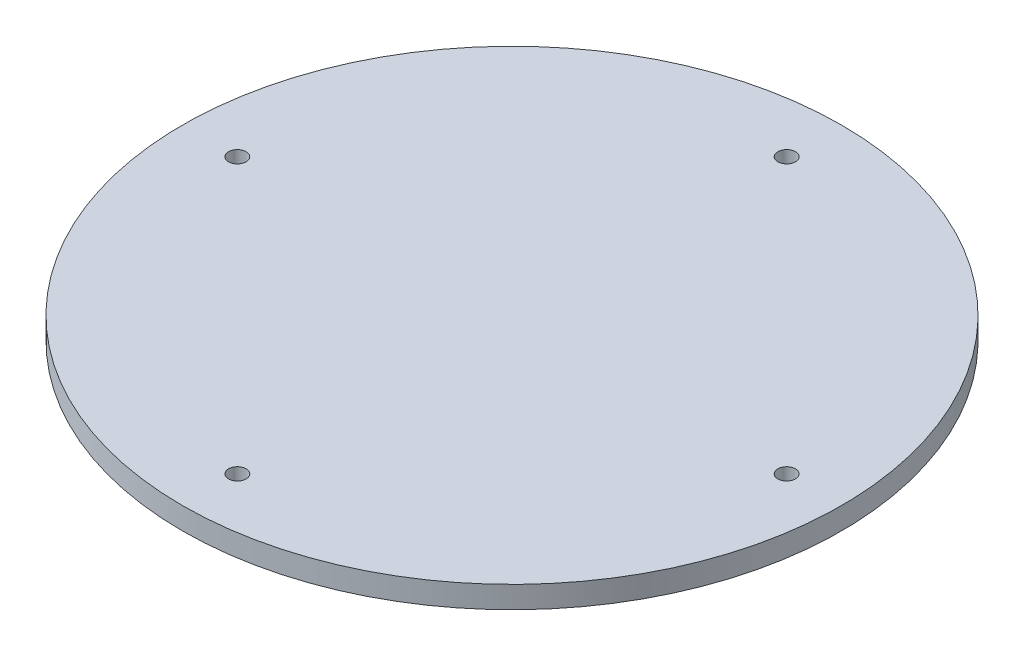
ISO-10303-21;
HEADER;
FILE_DESCRIPTION(('STEP AP214'),'2;1');
FILE_NAME('part.step','',(''),(''),'','','');
FILE_SCHEMA(('AUTOMOTIVE_DESIGN { 1 0 10303 214 1 1 1 1 }'));
ENDSEC;
DATA;
#1=APPLICATION_CONTEXT('core data for automotive mechanical design processes');
#2=APPLICATION_PROTOCOL_DEFINITION('international standard','automotive_design',2000,#1);
#3=PRODUCT_CONTEXT('',#1,'mechanical');
#4=PRODUCT('Part','Part','',(#3));
#5=PRODUCT_RELATED_PRODUCT_CATEGORY('part','',(#4));
#6=PRODUCT_DEFINITION_FORMATION('','',#4);
#7=PRODUCT_DEFINITION_CONTEXT('part definition',#1,'design');
#8=PRODUCT_DEFINITION('design','',#6,#7);
#9=PRODUCT_DEFINITION_SHAPE('','',#8);
#10=(LENGTH_UNIT() NAMED_UNIT(*) SI_UNIT(.MILLI.,.METRE.));
#11=(NAMED_UNIT(*) PLANE_ANGLE_UNIT() SI_UNIT($,.RADIAN.));
#12=(NAMED_UNIT(*) SI_UNIT($,.STERADIAN.) SOLID_ANGLE_UNIT());
#13=UNCERTAINTY_MEASURE_WITH_UNIT(LENGTH_MEASURE(1.E-05),#10,'distance_accuracy_value','');
#14=(GEOMETRIC_REPRESENTATION_CONTEXT(3) GLOBAL_UNCERTAINTY_ASSIGNED_CONTEXT((#13)) GLOBAL_UNIT_ASSIGNED_CONTEXT((#10,
#11,#12)) REPRESENTATION_CONTEXT('',''));
#15=CARTESIAN_POINT('',(0.,0.,0.));
#16=DIRECTION('',(0.,0.,1.));
#17=DIRECTION('',(1.,0.,0.));
#18=AXIS2_PLACEMENT_3D('',#15,#16,#17);
#19=CARTESIAN_POINT('',(0.,5.,0.));
#20=DIRECTION('',(0.,1.,0.));
#21=DIRECTION('',(0.,0.,1.));
#22=AXIS2_PLACEMENT_3D('',#19,#20,#21);
#23=PLANE('',#22);
#24=CARTESIAN_POINT('',(3.52975155131649E-12,5.,62.5));
#25=DIRECTION('',(0.,1.,0.));
#26=DIRECTION('',(0.,0.,1.));
#27=AXIS2_PLACEMENT_3D('',#24,#25,#26);
#28=CIRCLE('',#27,2.00000000000379);
#29=CARTESIAN_POINT('',(3.52975155131649E-12,5.,64.5000000000038));
#30=VERTEX_POINT('',#29);
#31=EDGE_CURVE('E57',#30,#30,#28,.T.);
#32=ORIENTED_EDGE('',*,*,#31,.F.);
#33=EDGE_LOOP('',(#32));
#34=FACE_BOUND('',#33,.T.);
#35=CARTESIAN_POINT('',(0.,5.,-62.5));
#36=DIRECTION('',(0.,1.,0.));
#37=DIRECTION('',(0.,0.,1.));
#38=AXIS2_PLACEMENT_3D('',#35,#36,#37);
#39=CIRCLE('',#38,2.);
#40=CARTESIAN_POINT('',(0.,5.,-60.5));
#41=VERTEX_POINT('',#40);
#42=EDGE_CURVE('E46',#41,#41,#39,.T.);
#43=ORIENTED_EDGE('',*,*,#42,.F.);
#44=EDGE_LOOP('',(#43));
#45=FACE_BOUND('',#44,.T.);
#46=CARTESIAN_POINT('',(0.,5.,0.));
#47=DIRECTION('',(0.,1.,0.));
#48=DIRECTION('',(0.,0.,1.));
#49=AXIS2_PLACEMENT_3D('',#46,#47,#48);
#50=CIRCLE('',#49,75.);
#51=CARTESIAN_POINT('',(0.,5.,75.));
#52=VERTEX_POINT('',#51);
#53=EDGE_CURVE('E10',#52,#52,#50,.T.);
#54=ORIENTED_EDGE('',*,*,#53,.T.);
#55=EDGE_LOOP('',(#54));
#56=FACE_BOUND('',#55,.T.);
#57=CARTESIAN_POINT('',(62.5000000000018,5.,-1.76487577565824E-12));
#58=DIRECTION('',(0.,1.,0.));
#59=DIRECTION('',(0.,0.,1.));
#60=AXIS2_PLACEMENT_3D('',#57,#58,#59);
#61=CIRCLE('',#60,2.00000000000138);
#62=CARTESIAN_POINT('',(62.5000000000018,5.,1.99999999999961));
#63=VERTEX_POINT('',#62);
#64=EDGE_CURVE('E51',#63,#63,#61,.T.);
#65=ORIENTED_EDGE('',*,*,#64,.F.);
#66=EDGE_LOOP('',(#65));
#67=FACE_BOUND('',#66,.T.);
#68=CARTESIAN_POINT('',(-62.4999999999982,5.,1.77252981815291E-12));
#69=DIRECTION('',(0.,1.,0.));
#70=DIRECTION('',(0.,0.,1.));
#71=AXIS2_PLACEMENT_3D('',#68,#69,#70);
#72=CIRCLE('',#71,2.00000000000284);
#73=CARTESIAN_POINT('',(-62.4999999999982,5.,2.00000000000461));
#74=VERTEX_POINT('',#73);
#75=EDGE_CURVE('E63',#74,#74,#72,.T.);
#76=ORIENTED_EDGE('',*,*,#75,.F.);
#77=EDGE_LOOP('',(#76));
#78=FACE_BOUND('',#77,.T.);
#79=ADVANCED_FACE('F35',(#34,#45,#56,#67,#78),#23,.T.);
#80=CARTESIAN_POINT('',(0.,0.,0.));
#81=DIRECTION('',(0.,1.,0.));
#82=DIRECTION('',(0.,0.,1.));
#83=AXIS2_PLACEMENT_3D('',#80,#81,#82);
#84=PLANE('',#83);
#85=CARTESIAN_POINT('',(0.,0.,0.));
#86=DIRECTION('',(0.,1.,0.));
#87=DIRECTION('',(0.,0.,1.));
#88=AXIS2_PLACEMENT_3D('',#85,#86,#87);
#89=CIRCLE('',#88,75.);
#90=CARTESIAN_POINT('',(0.,0.,75.));
#91=VERTEX_POINT('',#90);
#92=EDGE_CURVE('E39',#91,#91,#89,.T.);
#93=ORIENTED_EDGE('',*,*,#92,.F.);
#94=EDGE_LOOP('',(#93));
#95=FACE_BOUND('',#94,.T.);
#96=CARTESIAN_POINT('',(0.,0.,-62.5));
#97=DIRECTION('',(0.,1.,0.));
#98=DIRECTION('',(0.,0.,1.));
#99=AXIS2_PLACEMENT_3D('',#96,#97,#98);
#100=CIRCLE('',#99,2.);
#101=CARTESIAN_POINT('',(0.,0.,-60.5));
#102=VERTEX_POINT('',#101);
#103=EDGE_CURVE('E48',#102,#102,#100,.T.);
#104=ORIENTED_EDGE('',*,*,#103,.T.);
#105=EDGE_LOOP('',(#104));
#106=FACE_BOUND('',#105,.T.);
#107=CARTESIAN_POINT('',(62.5000000000018,0.,-1.76487577565824E-12));
#108=DIRECTION('',(0.,1.,0.));
#109=DIRECTION('',(0.,0.,1.));
#110=AXIS2_PLACEMENT_3D('',#107,#108,#109);
#111=CIRCLE('',#110,2.00000000000138);
#112=CARTESIAN_POINT('',(62.5000000000018,0.,1.99999999999961));
#113=VERTEX_POINT('',#112);
#114=EDGE_CURVE('E54',#113,#113,#111,.T.);
#115=ORIENTED_EDGE('',*,*,#114,.T.);
#116=EDGE_LOOP('',(#115));
#117=FACE_BOUND('',#116,.T.);
#118=CARTESIAN_POINT('',(3.52975155131649E-12,0.,62.5));
#119=DIRECTION('',(0.,1.,0.));
#120=DIRECTION('',(0.,0.,1.));
#121=AXIS2_PLACEMENT_3D('',#118,#119,#120);
#122=CIRCLE('',#121,2.00000000000379);
#123=CARTESIAN_POINT('',(3.52975155131649E-12,0.,64.5000000000038));
#124=VERTEX_POINT('',#123);
#125=EDGE_CURVE('E60',#124,#124,#122,.T.);
#126=ORIENTED_EDGE('',*,*,#125,.T.);
#127=EDGE_LOOP('',(#126));
#128=FACE_BOUND('',#127,.T.);
#129=CARTESIAN_POINT('',(-62.4999999999982,0.,1.77252981815291E-12));
#130=DIRECTION('',(0.,1.,0.));
#131=DIRECTION('',(0.,0.,1.));
#132=AXIS2_PLACEMENT_3D('',#129,#130,#131);
#133=CIRCLE('',#132,2.00000000000284);
#134=CARTESIAN_POINT('',(-62.4999999999982,0.,2.00000000000461));
#135=VERTEX_POINT('',#134);
#136=EDGE_CURVE('E66',#135,#135,#133,.T.);
#137=ORIENTED_EDGE('',*,*,#136,.T.);
#138=EDGE_LOOP('',(#137));
#139=FACE_BOUND('',#138,.T.);
#140=ADVANCED_FACE('F76',(#95,#106,#117,#128,#139),#84,.F.);
#141=CARTESIAN_POINT('',(0.,5.,0.));
#142=DIRECTION('',(0.,-1.,0.));
#143=DIRECTION('',(0.,0.,-1.));
#144=AXIS2_PLACEMENT_3D('',#141,#142,#143);
#145=CYLINDRICAL_SURFACE('',#144,75.);
#146=ORIENTED_EDGE('',*,*,#53,.F.);
#147=EDGE_LOOP('',(#146));
#148=FACE_BOUND('',#147,.T.);
#149=ORIENTED_EDGE('',*,*,#92,.T.);
#150=EDGE_LOOP('',(#149));
#151=FACE_BOUND('',#150,.T.);
#152=ADVANCED_FACE('F37',(#148,#151),#145,.T.);
#153=CARTESIAN_POINT('',(0.,5.,-62.5));
#154=DIRECTION('',(0.,-1.,0.));
#155=DIRECTION('',(0.,0.,-1.));
#156=AXIS2_PLACEMENT_3D('',#153,#154,#155);
#157=CYLINDRICAL_SURFACE('',#156,2.);
#158=ORIENTED_EDGE('',*,*,#42,.T.);
#159=EDGE_LOOP('',(#158));
#160=FACE_BOUND('',#159,.T.);
#161=ORIENTED_EDGE('',*,*,#103,.F.);
#162=EDGE_LOOP('',(#161));
#163=FACE_BOUND('',#162,.T.);
#164=ADVANCED_FACE('F86',(#160,#163),#157,.F.);
#165=CARTESIAN_POINT('',(62.5000000000018,5.,-1.76487577565824E-12));
#166=DIRECTION('',(0.,-1.,0.));
#167=DIRECTION('',(0.,0.,-1.));
#168=AXIS2_PLACEMENT_3D('',#165,#166,#167);
#169=CYLINDRICAL_SURFACE('',#168,2.00000000000138);
#170=ORIENTED_EDGE('',*,*,#64,.T.);
#171=EDGE_LOOP('',(#170));
#172=FACE_BOUND('',#171,.T.);
#173=ORIENTED_EDGE('',*,*,#114,.F.);
#174=EDGE_LOOP('',(#173));
#175=FACE_BOUND('',#174,.T.);
#176=ADVANCED_FACE('F89',(#172,#175),#169,.F.);
#177=CARTESIAN_POINT('',(3.52975155131649E-12,5.,62.5));
#178=DIRECTION('',(0.,-1.,0.));
#179=DIRECTION('',(0.,0.,-1.));
#180=AXIS2_PLACEMENT_3D('',#177,#178,#179);
#181=CYLINDRICAL_SURFACE('',#180,2.00000000000379);
#182=ORIENTED_EDGE('',*,*,#31,.T.);
#183=EDGE_LOOP('',(#182));
#184=FACE_BOUND('',#183,.T.);
#185=ORIENTED_EDGE('',*,*,#125,.F.);
#186=EDGE_LOOP('',(#185));
#187=FACE_BOUND('',#186,.T.);
#188=ADVANCED_FACE('F93',(#184,#187),#181,.F.);
#189=CARTESIAN_POINT('',(-62.4999999999982,5.,1.77252981815291E-12));
#190=DIRECTION('',(0.,-1.,0.));
#191=DIRECTION('',(0.,0.,-1.));
#192=AXIS2_PLACEMENT_3D('',#189,#190,#191);
#193=CYLINDRICAL_SURFACE('',#192,2.00000000000284);
#194=ORIENTED_EDGE('',*,*,#75,.T.);
#195=EDGE_LOOP('',(#194));
#196=FACE_BOUND('',#195,.T.);
#197=ORIENTED_EDGE('',*,*,#136,.F.);
#198=EDGE_LOOP('',(#197));
#199=FACE_BOUND('',#198,.T.);
#200=ADVANCED_FACE('F72',(#196,#199),#193,.F.);
#201=CLOSED_SHELL('',(#79,#140,#152,#164,#176,#188,#200));
#202=MANIFOLD_SOLID_BREP('B2',#201);
#203=ADVANCED_BREP_SHAPE_REPRESENTATION('',(#18,#202),#14);
#204=SHAPE_DEFINITION_REPRESENTATION(#9,#203);
ENDSEC;
END-ISO-10303-21;
